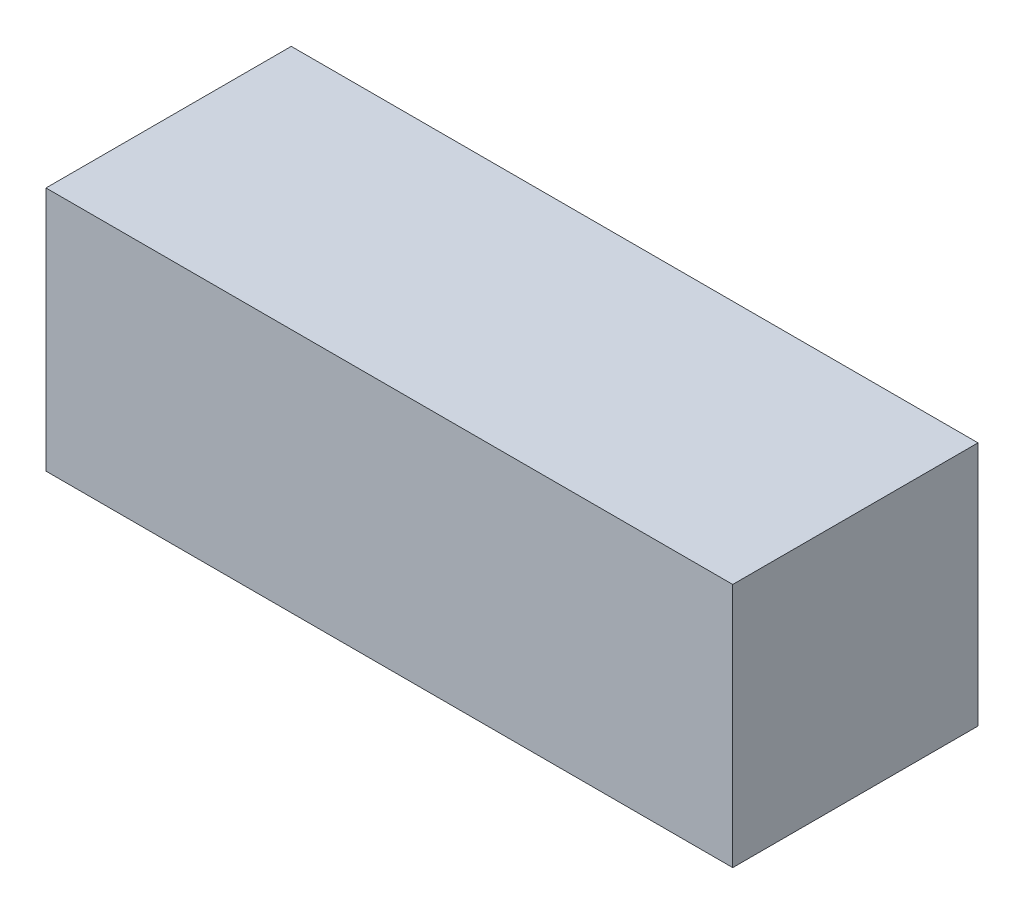
ISO-10303-21;
HEADER;
FILE_DESCRIPTION(('STEP AP214'),'2;1');
FILE_NAME('part.step','',(''),(''),'','','');
FILE_SCHEMA(('AUTOMOTIVE_DESIGN { 1 0 10303 214 1 1 1 1 }'));
ENDSEC;
DATA;
#1=APPLICATION_CONTEXT('core data for automotive mechanical design processes');
#2=APPLICATION_PROTOCOL_DEFINITION('international standard','automotive_design',2000,#1);
#3=PRODUCT_CONTEXT('',#1,'mechanical');
#4=PRODUCT('Part','Part','',(#3));
#5=PRODUCT_RELATED_PRODUCT_CATEGORY('part','',(#4));
#6=PRODUCT_DEFINITION_FORMATION('','',#4);
#7=PRODUCT_DEFINITION_CONTEXT('part definition',#1,'design');
#8=PRODUCT_DEFINITION('design','',#6,#7);
#9=PRODUCT_DEFINITION_SHAPE('','',#8);
#10=(LENGTH_UNIT() NAMED_UNIT(*) SI_UNIT(.MILLI.,.METRE.));
#11=(NAMED_UNIT(*) PLANE_ANGLE_UNIT() SI_UNIT($,.RADIAN.));
#12=(NAMED_UNIT(*) SI_UNIT($,.STERADIAN.) SOLID_ANGLE_UNIT());
#13=UNCERTAINTY_MEASURE_WITH_UNIT(LENGTH_MEASURE(1.E-05),#10,'distance_accuracy_value','');
#14=(GEOMETRIC_REPRESENTATION_CONTEXT(3) GLOBAL_UNCERTAINTY_ASSIGNED_CONTEXT((#13)) GLOBAL_UNIT_ASSIGNED_CONTEXT((#10,
#11,#12)) REPRESENTATION_CONTEXT('',''));
#15=CARTESIAN_POINT('',(0.,0.,0.));
#16=DIRECTION('',(0.,0.,1.));
#17=DIRECTION('',(1.,0.,0.));
#18=AXIS2_PLACEMENT_3D('',#15,#16,#17);
#19=CARTESIAN_POINT('',(0.,0.,50.));
#20=DIRECTION('',(1.,0.,0.));
#21=DIRECTION('',(0.,0.,-1.));
#22=AXIS2_PLACEMENT_3D('',#19,#20,#21);
#23=PLANE('',#22);
#24=DIRECTION('',(0.,-1.,0.));
#25=VECTOR('',#24,1.);
#26=CARTESIAN_POINT('',(0.,0.,0.));
#27=LINE('',#26,#25);
#28=CARTESIAN_POINT('',(0.,50.,0.));
#29=VERTEX_POINT('',#28);
#30=CARTESIAN_POINT('',(0.,0.,0.));
#31=VERTEX_POINT('',#30);
#32=EDGE_CURVE('E107',#29,#31,#27,.T.);
#33=ORIENTED_EDGE('',*,*,#32,.T.);
#34=DIRECTION('',(0.,0.,-1.));
#35=VECTOR('',#34,1.);
#36=CARTESIAN_POINT('',(0.,0.,50.));
#37=LINE('',#36,#35);
#38=CARTESIAN_POINT('',(0.,0.,50.));
#39=VERTEX_POINT('',#38);
#40=EDGE_CURVE('E11',#39,#31,#37,.T.);
#41=ORIENTED_EDGE('',*,*,#40,.F.);
#42=DIRECTION('',(0.,-1.,0.));
#43=VECTOR('',#42,1.);
#44=CARTESIAN_POINT('',(0.,0.,50.));
#45=LINE('',#44,#43);
#46=CARTESIAN_POINT('',(0.,50.,50.));
#47=VERTEX_POINT('',#46);
#48=EDGE_CURVE('E91',#47,#39,#45,.T.);
#49=ORIENTED_EDGE('',*,*,#48,.F.);
#50=DIRECTION('',(0.,0.,-1.));
#51=VECTOR('',#50,1.);
#52=CARTESIAN_POINT('',(0.,50.,50.));
#53=LINE('',#52,#51);
#54=EDGE_CURVE('E103',#47,#29,#53,.T.);
#55=ORIENTED_EDGE('',*,*,#54,.T.);
#56=EDGE_LOOP('',(#33,#41,#49,#55));
#57=FACE_BOUND('',#56,.T.);
#58=ADVANCED_FACE('F39',(#57),#23,.F.);
#59=CARTESIAN_POINT('',(0.,0.,50.));
#60=DIRECTION('',(0.,1.,0.));
#61=DIRECTION('',(0.,0.,1.));
#62=AXIS2_PLACEMENT_3D('',#59,#60,#61);
#63=PLANE('',#62);
#64=DIRECTION('',(1.,0.,0.));
#65=VECTOR('',#64,1.);
#66=CARTESIAN_POINT('',(0.,0.,0.));
#67=LINE('',#66,#65);
#68=CARTESIAN_POINT('',(140.,0.,0.));
#69=VERTEX_POINT('',#68);
#70=EDGE_CURVE('E96',#31,#69,#67,.T.);
#71=ORIENTED_EDGE('',*,*,#70,.T.);
#72=DIRECTION('',(0.,0.,-1.));
#73=VECTOR('',#72,1.);
#74=CARTESIAN_POINT('',(140.,0.,50.));
#75=LINE('',#74,#73);
#76=CARTESIAN_POINT('',(140.,0.,50.));
#77=VERTEX_POINT('',#76);
#78=EDGE_CURVE('E48',#77,#69,#75,.T.);
#79=ORIENTED_EDGE('',*,*,#78,.F.);
#80=DIRECTION('',(1.,0.,0.));
#81=VECTOR('',#80,1.);
#82=CARTESIAN_POINT('',(0.,0.,50.));
#83=LINE('',#82,#81);
#84=EDGE_CURVE('E86',#39,#77,#83,.T.);
#85=ORIENTED_EDGE('',*,*,#84,.F.);
#86=ORIENTED_EDGE('',*,*,#40,.T.);
#87=EDGE_LOOP('',(#71,#79,#85,#86));
#88=FACE_BOUND('',#87,.T.);
#89=ADVANCED_FACE('F95',(#88),#63,.F.);
#90=CARTESIAN_POINT('',(140.,0.,50.));
#91=DIRECTION('',(-1.,0.,0.));
#92=DIRECTION('',(0.,0.,1.));
#93=AXIS2_PLACEMENT_3D('',#90,#91,#92);
#94=PLANE('',#93);
#95=DIRECTION('',(0.,1.,0.));
#96=VECTOR('',#95,1.);
#97=CARTESIAN_POINT('',(140.,0.,0.));
#98=LINE('',#97,#96);
#99=CARTESIAN_POINT('',(140.,50.,0.));
#100=VERTEX_POINT('',#99);
#101=EDGE_CURVE('E73',#69,#100,#98,.T.);
#102=ORIENTED_EDGE('',*,*,#101,.T.);
#103=DIRECTION('',(0.,0.,-1.));
#104=VECTOR('',#103,1.);
#105=CARTESIAN_POINT('',(140.,50.,50.));
#106=LINE('',#105,#104);
#107=CARTESIAN_POINT('',(140.,50.,50.));
#108=VERTEX_POINT('',#107);
#109=EDGE_CURVE('E98',#108,#100,#106,.T.);
#110=ORIENTED_EDGE('',*,*,#109,.F.);
#111=DIRECTION('',(0.,1.,0.));
#112=VECTOR('',#111,1.);
#113=CARTESIAN_POINT('',(140.,0.,50.));
#114=LINE('',#113,#112);
#115=EDGE_CURVE('E89',#77,#108,#114,.T.);
#116=ORIENTED_EDGE('',*,*,#115,.F.);
#117=ORIENTED_EDGE('',*,*,#78,.T.);
#118=EDGE_LOOP('',(#102,#110,#116,#117));
#119=FACE_BOUND('',#118,.T.);
#120=ADVANCED_FACE('F99',(#119),#94,.F.);
#121=CARTESIAN_POINT('',(0.,50.,50.));
#122=DIRECTION('',(0.,-1.,0.));
#123=DIRECTION('',(0.,0.,-1.));
#124=AXIS2_PLACEMENT_3D('',#121,#122,#123);
#125=PLANE('',#124);
#126=DIRECTION('',(-1.,0.,0.));
#127=VECTOR('',#126,1.);
#128=CARTESIAN_POINT('',(0.,50.,0.));
#129=LINE('',#128,#127);
#130=EDGE_CURVE('E79',#100,#29,#129,.T.);
#131=ORIENTED_EDGE('',*,*,#130,.T.);
#132=ORIENTED_EDGE('',*,*,#54,.F.);
#133=DIRECTION('',(-1.,0.,0.));
#134=VECTOR('',#133,1.);
#135=CARTESIAN_POINT('',(0.,50.,50.));
#136=LINE('',#135,#134);
#137=EDGE_CURVE('E56',#108,#47,#136,.T.);
#138=ORIENTED_EDGE('',*,*,#137,.F.);
#139=ORIENTED_EDGE('',*,*,#109,.T.);
#140=EDGE_LOOP('',(#131,#132,#138,#139));
#141=FACE_BOUND('',#140,.T.);
#142=ADVANCED_FACE('F120',(#141),#125,.F.);
#143=CARTESIAN_POINT('',(0.,0.,50.));
#144=DIRECTION('',(0.,0.,-1.));
#145=DIRECTION('',(-1.,0.,0.));
#146=AXIS2_PLACEMENT_3D('',#143,#144,#145);
#147=PLANE('',#146);
#148=ORIENTED_EDGE('',*,*,#48,.T.);
#149=ORIENTED_EDGE('',*,*,#84,.T.);
#150=ORIENTED_EDGE('',*,*,#115,.T.);
#151=ORIENTED_EDGE('',*,*,#137,.T.);
#152=EDGE_LOOP('',(#148,#149,#150,#151));
#153=FACE_BOUND('',#152,.T.);
#154=ADVANCED_FACE('F87',(#153),#147,.F.);
#155=CARTESIAN_POINT('',(0.,0.,0.));
#156=DIRECTION('',(0.,0.,-1.));
#157=DIRECTION('',(-1.,0.,0.));
#158=AXIS2_PLACEMENT_3D('',#155,#156,#157);
#159=PLANE('',#158);
#160=ORIENTED_EDGE('',*,*,#32,.F.);
#161=ORIENTED_EDGE('',*,*,#130,.F.);
#162=ORIENTED_EDGE('',*,*,#101,.F.);
#163=ORIENTED_EDGE('',*,*,#70,.F.);
#164=EDGE_LOOP('',(#160,#161,#162,#163));
#165=FACE_BOUND('',#164,.T.);
#166=ADVANCED_FACE('F123',(#165),#159,.T.);
#167=CLOSED_SHELL('',(#58,#89,#120,#142,#154,#166));
#168=MANIFOLD_SOLID_BREP('B2',#167);
#169=ADVANCED_BREP_SHAPE_REPRESENTATION('',(#18,#168),#14);
#170=SHAPE_DEFINITION_REPRESENTATION(#9,#169);
ENDSEC;
END-ISO-10303-21;
